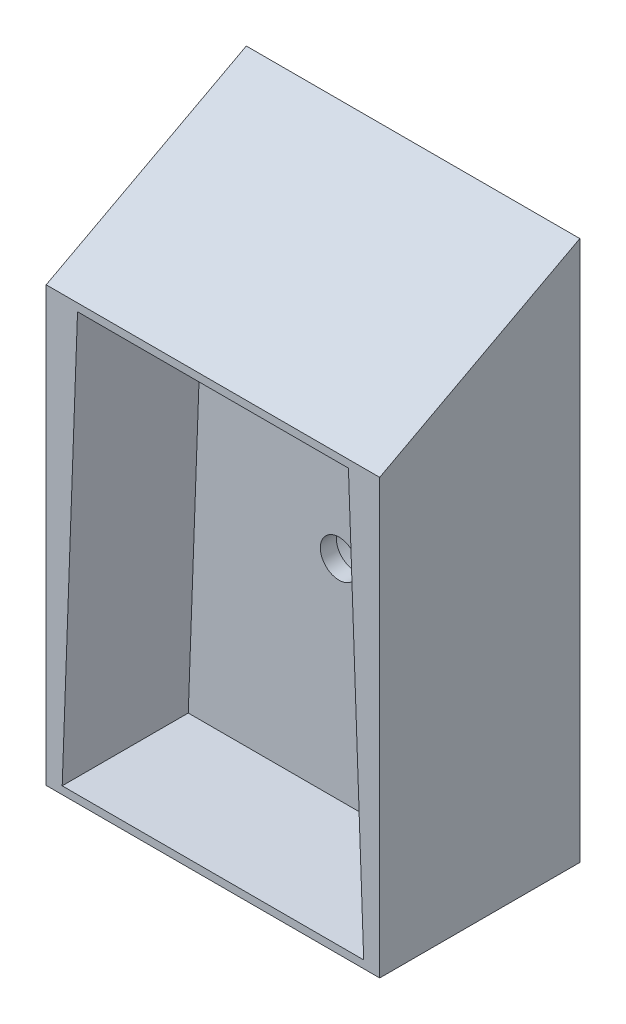
ISO-10303-21;
HEADER;
FILE_DESCRIPTION(('STEP AP214'),'2;1');
FILE_NAME('part.step','',(''),(''),'','','');
FILE_SCHEMA(('AUTOMOTIVE_DESIGN { 1 0 10303 214 1 1 1 1 }'));
ENDSEC;
DATA;
#1=APPLICATION_CONTEXT('core data for automotive mechanical design processes');
#2=APPLICATION_PROTOCOL_DEFINITION('international standard','automotive_design',2000,#1);
#3=PRODUCT_CONTEXT('',#1,'mechanical');
#4=PRODUCT('Part','Part','',(#3));
#5=PRODUCT_RELATED_PRODUCT_CATEGORY('part','',(#4));
#6=PRODUCT_DEFINITION_FORMATION('','',#4);
#7=PRODUCT_DEFINITION_CONTEXT('part definition',#1,'design');
#8=PRODUCT_DEFINITION('design','',#6,#7);
#9=PRODUCT_DEFINITION_SHAPE('','',#8);
#10=(LENGTH_UNIT() NAMED_UNIT(*) SI_UNIT(.MILLI.,.METRE.));
#11=(NAMED_UNIT(*) PLANE_ANGLE_UNIT() SI_UNIT($,.RADIAN.));
#12=(NAMED_UNIT(*) SI_UNIT($,.STERADIAN.) SOLID_ANGLE_UNIT());
#13=UNCERTAINTY_MEASURE_WITH_UNIT(LENGTH_MEASURE(1.E-05),#10,'distance_accuracy_value','');
#14=(GEOMETRIC_REPRESENTATION_CONTEXT(3) GLOBAL_UNCERTAINTY_ASSIGNED_CONTEXT((#13)) GLOBAL_UNIT_ASSIGNED_CONTEXT((#10,
#11,#12)) REPRESENTATION_CONTEXT('',''));
#15=CARTESIAN_POINT('',(0.,0.,0.));
#16=DIRECTION('',(0.,0.,1.));
#17=DIRECTION('',(1.,0.,0.));
#18=AXIS2_PLACEMENT_3D('',#15,#16,#17);
#19=CARTESIAN_POINT('',(0.,0.,0.));
#20=DIRECTION('',(0.,0.,1.));
#21=DIRECTION('',(1.,0.,0.));
#22=AXIS2_PLACEMENT_3D('',#19,#20,#21);
#23=CYLINDRICAL_SURFACE('',#22,2.8);
#24=CARTESIAN_POINT('',(0.,0.,11.1));
#25=DIRECTION('',(0.,0.,1.));
#26=DIRECTION('',(1.,0.,0.));
#27=AXIS2_PLACEMENT_3D('',#24,#25,#26);
#28=CIRCLE('',#27,2.8);
#29=CARTESIAN_POINT('',(2.8,0.,11.1));
#30=VERTEX_POINT('',#29);
#31=EDGE_CURVE('E380',#30,#30,#28,.T.);
#32=ORIENTED_EDGE('',*,*,#31,.T.);
#33=EDGE_LOOP('',(#32));
#34=FACE_BOUND('',#33,.T.);
#35=CARTESIAN_POINT('',(0.,0.,8.7));
#36=DIRECTION('',(0.,0.,-1.));
#37=DIRECTION('',(-1.,0.,0.));
#38=AXIS2_PLACEMENT_3D('',#35,#36,#37);
#39=CIRCLE('',#38,2.8);
#40=CARTESIAN_POINT('',(-2.8,0.,8.7));
#41=VERTEX_POINT('',#40);
#42=EDGE_CURVE('E44',#41,#41,#39,.F.);
#43=ORIENTED_EDGE('',*,*,#42,.F.);
#44=EDGE_LOOP('',(#43));
#45=FACE_BOUND('',#44,.T.);
#46=ADVANCED_FACE('F40',(#34,#45),#23,.F.);
#47=CARTESIAN_POINT('',(-25.,32.5,30.));
#48=DIRECTION('',(1.,0.,0.));
#49=DIRECTION('',(0.,1.,0.));
#50=AXIS2_PLACEMENT_3D('',#47,#48,#49);
#51=PLANE('',#50);
#52=DIRECTION('',(0.,-1.,0.));
#53=VECTOR('',#52,1.);
#54=CARTESIAN_POINT('',(-25.,32.5,0.));
#55=LINE('',#54,#53);
#56=CARTESIAN_POINT('',(-25.,48.5,0.));
#57=VERTEX_POINT('',#56);
#58=CARTESIAN_POINT('',(-25.,-32.5,0.));
#59=VERTEX_POINT('',#58);
#60=EDGE_CURVE('E155',#57,#59,#55,.T.);
#61=ORIENTED_EDGE('',*,*,#60,.T.);
#62=DIRECTION('',(0.,0.,-1.));
#63=VECTOR('',#62,1.);
#64=CARTESIAN_POINT('',(-25.,-32.5,30.));
#65=LINE('',#64,#63);
#66=CARTESIAN_POINT('',(-25.,-32.5,30.));
#67=VERTEX_POINT('',#66);
#68=EDGE_CURVE('E12',#67,#59,#65,.T.);
#69=ORIENTED_EDGE('',*,*,#68,.F.);
#70=DIRECTION('',(0.,-1.,0.));
#71=VECTOR('',#70,1.);
#72=CARTESIAN_POINT('',(-25.,32.5,30.));
#73=LINE('',#72,#71);
#74=CARTESIAN_POINT('',(-25.,32.5,30.));
#75=VERTEX_POINT('',#74);
#76=EDGE_CURVE('E156',#75,#67,#73,.T.);
#77=ORIENTED_EDGE('',*,*,#76,.F.);
#78=DIRECTION('',(0.,-0.470588235294118,0.882352941176471));
#79=VECTOR('',#78,1.);
#80=CARTESIAN_POINT('',(-25.,48.5,0.));
#81=LINE('',#80,#79);
#82=EDGE_CURVE('E147',#57,#75,#81,.T.);
#83=ORIENTED_EDGE('',*,*,#82,.F.);
#84=EDGE_LOOP('',(#61,#69,#77,#83));
#85=FACE_BOUND('',#84,.T.);
#86=ADVANCED_FACE('F42',(#85),#51,.F.);
#87=CARTESIAN_POINT('',(-25.,-32.5,30.));
#88=DIRECTION('',(0.,1.,0.));
#89=DIRECTION('',(0.,0.,1.));
#90=AXIS2_PLACEMENT_3D('',#87,#88,#89);
#91=PLANE('',#90);
#92=DIRECTION('',(1.,0.,0.));
#93=VECTOR('',#92,1.);
#94=CARTESIAN_POINT('',(-25.,-32.5,0.));
#95=LINE('',#94,#93);
#96=CARTESIAN_POINT('',(25.,-32.5,0.));
#97=VERTEX_POINT('',#96);
#98=EDGE_CURVE('E79',#59,#97,#95,.T.);
#99=ORIENTED_EDGE('',*,*,#98,.T.);
#100=DIRECTION('',(0.,0.,-1.));
#101=VECTOR('',#100,1.);
#102=CARTESIAN_POINT('',(25.,-32.5,30.));
#103=LINE('',#102,#101);
#104=CARTESIAN_POINT('',(25.,-32.5,30.));
#105=VERTEX_POINT('',#104);
#106=EDGE_CURVE('E49',#105,#97,#103,.T.);
#107=ORIENTED_EDGE('',*,*,#106,.F.);
#108=DIRECTION('',(1.,0.,0.));
#109=VECTOR('',#108,1.);
#110=CARTESIAN_POINT('',(-25.,-32.5,30.));
#111=LINE('',#110,#109);
#112=EDGE_CURVE('E84',#67,#105,#111,.T.);
#113=ORIENTED_EDGE('',*,*,#112,.F.);
#114=ORIENTED_EDGE('',*,*,#68,.T.);
#115=EDGE_LOOP('',(#99,#107,#113,#114));
#116=FACE_BOUND('',#115,.T.);
#117=ADVANCED_FACE('F190',(#116),#91,.F.);
#118=CARTESIAN_POINT('',(25.,32.5,30.));
#119=DIRECTION('',(-1.,0.,0.));
#120=DIRECTION('',(0.,0.,1.));
#121=AXIS2_PLACEMENT_3D('',#118,#119,#120);
#122=PLANE('',#121);
#123=DIRECTION('',(0.,1.,0.));
#124=VECTOR('',#123,1.);
#125=CARTESIAN_POINT('',(25.,32.5,0.));
#126=LINE('',#125,#124);
#127=CARTESIAN_POINT('',(25.,48.5,0.));
#128=VERTEX_POINT('',#127);
#129=EDGE_CURVE('E158',#97,#128,#126,.T.);
#130=ORIENTED_EDGE('',*,*,#129,.T.);
#131=DIRECTION('',(0.,-0.470588235294118,0.882352941176471));
#132=VECTOR('',#131,1.);
#133=CARTESIAN_POINT('',(25.,48.5,0.));
#134=LINE('',#133,#132);
#135=CARTESIAN_POINT('',(25.,32.5,30.));
#136=VERTEX_POINT('',#135);
#137=EDGE_CURVE('E145',#128,#136,#134,.T.);
#138=ORIENTED_EDGE('',*,*,#137,.T.);
#139=DIRECTION('',(0.,1.,0.));
#140=VECTOR('',#139,1.);
#141=CARTESIAN_POINT('',(25.,32.5,30.));
#142=LINE('',#141,#140);
#143=EDGE_CURVE('E160',#105,#136,#142,.T.);
#144=ORIENTED_EDGE('',*,*,#143,.F.);
#145=ORIENTED_EDGE('',*,*,#106,.T.);
#146=EDGE_LOOP('',(#130,#138,#144,#145));
#147=FACE_BOUND('',#146,.T.);
#148=ADVANCED_FACE('F170',(#147),#122,.F.);
#149=CARTESIAN_POINT('',(0.,0.,30.));
#150=DIRECTION('',(0.,0.,1.));
#151=DIRECTION('',(1.,0.,0.));
#152=AXIS2_PLACEMENT_3D('',#149,#150,#151);
#153=PLANE('',#152);
#154=DIRECTION('',(1.,0.,0.));
#155=VECTOR('',#154,1.);
#156=CARTESIAN_POINT('',(22.6,-31.35,30.));
#157=LINE('',#156,#155);
#158=CARTESIAN_POINT('',(-22.6,-31.35,30.));
#159=VERTEX_POINT('',#158);
#160=CARTESIAN_POINT('',(22.6,-31.35,30.));
#161=VERTEX_POINT('',#160);
#162=EDGE_CURVE('E56',#159,#161,#157,.T.);
#163=ORIENTED_EDGE('',*,*,#162,.F.);
#164=DIRECTION('',(-0.036657960183853,-0.99932787109895,0.));
#165=VECTOR('',#164,1.);
#166=CARTESIAN_POINT('',(-20.3,31.35,30.));
#167=LINE('',#166,#165);
#168=CARTESIAN_POINT('',(-20.3,31.35,30.));
#169=VERTEX_POINT('',#168);
#170=EDGE_CURVE('E134',#169,#159,#167,.T.);
#171=ORIENTED_EDGE('',*,*,#170,.F.);
#172=DIRECTION('',(-1.,0.,0.));
#173=VECTOR('',#172,1.);
#174=CARTESIAN_POINT('',(-20.3,31.35,30.));
#175=LINE('',#174,#173);
#176=CARTESIAN_POINT('',(20.31,31.35,30.));
#177=VERTEX_POINT('',#176);
#178=EDGE_CURVE('E118',#177,#169,#175,.T.);
#179=ORIENTED_EDGE('',*,*,#178,.F.);
#180=DIRECTION('',(-0.0364987905344166,0.999333697165029,0.));
#181=VECTOR('',#180,1.);
#182=CARTESIAN_POINT('',(20.31,31.35,30.));
#183=LINE('',#182,#181);
#184=EDGE_CURVE('E128',#161,#177,#183,.T.);
#185=ORIENTED_EDGE('',*,*,#184,.F.);
#186=EDGE_LOOP('',(#163,#171,#179,#185));
#187=FACE_BOUND('',#186,.T.);
#188=ORIENTED_EDGE('',*,*,#76,.T.);
#189=ORIENTED_EDGE('',*,*,#112,.T.);
#190=ORIENTED_EDGE('',*,*,#143,.T.);
#191=DIRECTION('',(-1.,0.,0.));
#192=VECTOR('',#191,1.);
#193=CARTESIAN_POINT('',(-25.,32.5,30.));
#194=LINE('',#193,#192);
#195=EDGE_CURVE('E65',#136,#75,#194,.T.);
#196=ORIENTED_EDGE('',*,*,#195,.T.);
#197=EDGE_LOOP('',(#188,#189,#190,#196));
#198=FACE_BOUND('',#197,.T.);
#199=ADVANCED_FACE('F132',(#187,#198),#153,.T.);
#200=CARTESIAN_POINT('',(0.,0.,0.));
#201=DIRECTION('',(0.,0.,1.));
#202=DIRECTION('',(1.,0.,0.));
#203=AXIS2_PLACEMENT_3D('',#200,#201,#202);
#204=PLANE('',#203);
#205=CARTESIAN_POINT('',(7.1490132204346,26.6072132920385,0.));
#206=DIRECTION('',(0.,0.,-1.));
#207=DIRECTION('',(1.,0.,0.));
#208=AXIS2_PLACEMENT_3D('',#205,#206,#207);
#209=CIRCLE('',#208,2.35);
#210=CARTESIAN_POINT('',(9.4990132204346,26.6072132920385,0.));
#211=VERTEX_POINT('',#210);
#212=EDGE_CURVE('E354',#211,#211,#209,.T.);
#213=ORIENTED_EDGE('',*,*,#212,.F.);
#214=EDGE_LOOP('',(#213));
#215=FACE_BOUND('',#214,.T.);
#216=CARTESIAN_POINT('',(-7.1490132204346,37.1927867079615,0.));
#217=DIRECTION('',(0.,0.,-1.));
#218=DIRECTION('',(1.,0.,0.));
#219=AXIS2_PLACEMENT_3D('',#216,#217,#218);
#220=CIRCLE('',#219,2.35);
#221=CARTESIAN_POINT('',(-4.7990132204346,37.1927867079615,0.));
#222=VERTEX_POINT('',#221);
#223=EDGE_CURVE('E368',#222,#222,#220,.T.);
#224=ORIENTED_EDGE('',*,*,#223,.F.);
#225=EDGE_LOOP('',(#224));
#226=FACE_BOUND('',#225,.T.);
#227=CARTESIAN_POINT('',(7.1490132204346,37.1927867079615,0.));
#228=DIRECTION('',(0.,0.,-1.));
#229=DIRECTION('',(-1.,0.,0.));
#230=AXIS2_PLACEMENT_3D('',#227,#228,#229);
#231=CIRCLE('',#230,2.35);
#232=CARTESIAN_POINT('',(4.7990132204346,37.1927867079615,0.));
#233=VERTEX_POINT('',#232);
#234=EDGE_CURVE('E363',#233,#233,#231,.T.);
#235=ORIENTED_EDGE('',*,*,#234,.F.);
#236=EDGE_LOOP('',(#235));
#237=FACE_BOUND('',#236,.T.);
#238=CARTESIAN_POINT('',(-7.1490132204346,26.6072132920385,0.));
#239=DIRECTION('',(0.,0.,-1.));
#240=DIRECTION('',(-1.,0.,0.));
#241=AXIS2_PLACEMENT_3D('',#238,#239,#240);
#242=CIRCLE('',#241,2.35);
#243=CARTESIAN_POINT('',(-9.4990132204346,26.6072132920385,0.));
#244=VERTEX_POINT('',#243);
#245=EDGE_CURVE('E353',#244,#244,#242,.T.);
#246=ORIENTED_EDGE('',*,*,#245,.F.);
#247=EDGE_LOOP('',(#246));
#248=FACE_BOUND('',#247,.T.);
#249=CARTESIAN_POINT('',(0.,0.,0.));
#250=DIRECTION('',(0.,0.,-1.));
#251=DIRECTION('',(-1.,0.,0.));
#252=AXIS2_PLACEMENT_3D('',#249,#250,#251);
#253=CIRCLE('',#252,7.5);
#254=CARTESIAN_POINT('',(-7.5,0.,0.));
#255=VERTEX_POINT('',#254);
#256=EDGE_CURVE('E373',#255,#255,#253,.T.);
#257=ORIENTED_EDGE('',*,*,#256,.F.);
#258=EDGE_LOOP('',(#257));
#259=FACE_BOUND('',#258,.T.);
#260=ORIENTED_EDGE('',*,*,#60,.F.);
#261=DIRECTION('',(1.,0.,0.));
#262=VECTOR('',#261,1.);
#263=CARTESIAN_POINT('',(-25.,48.5,0.));
#264=LINE('',#263,#262);
#265=EDGE_CURVE('E150',#57,#128,#264,.T.);
#266=ORIENTED_EDGE('',*,*,#265,.T.);
#267=ORIENTED_EDGE('',*,*,#129,.F.);
#268=ORIENTED_EDGE('',*,*,#98,.F.);
#269=EDGE_LOOP('',(#260,#266,#267,#268));
#270=FACE_BOUND('',#269,.T.);
#271=ADVANCED_FACE('F172',(#215,#226,#237,#248,#259,#270),#204,.F.);
#272=CARTESIAN_POINT('',(-25.,48.5,0.));
#273=DIRECTION('',(0.,0.882352941176471,0.470588235294118));
#274=DIRECTION('',(0.,-0.470588235294118,0.882352941176471));
#275=AXIS2_PLACEMENT_3D('',#272,#273,#274);
#276=PLANE('',#275);
#277=ORIENTED_EDGE('',*,*,#137,.F.);
#278=ORIENTED_EDGE('',*,*,#265,.F.);
#279=ORIENTED_EDGE('',*,*,#82,.T.);
#280=ORIENTED_EDGE('',*,*,#195,.F.);
#281=EDGE_LOOP('',(#277,#278,#279,#280));
#282=FACE_BOUND('',#281,.T.);
#283=ADVANCED_FACE('F177',(#282),#276,.T.);
#284=CARTESIAN_POINT('',(22.6,-31.35,-85.093790177478));
#285=DIRECTION('',(0.,-1.,0.));
#286=DIRECTION('',(0.,0.,-1.));
#287=AXIS2_PLACEMENT_3D('',#284,#285,#286);
#288=PLANE('',#287);
#289=DIRECTION('',(-1.,0.,0.));
#290=VECTOR('',#289,1.);
#291=CARTESIAN_POINT('',(22.6,-31.35,11.1));
#292=LINE('',#291,#290);
#293=CARTESIAN_POINT('',(22.6,-31.35,11.1));
#294=VERTEX_POINT('',#293);
#295=CARTESIAN_POINT('',(-22.6,-31.35,11.1));
#296=VERTEX_POINT('',#295);
#297=EDGE_CURVE('E146',#294,#296,#292,.T.);
#298=ORIENTED_EDGE('',*,*,#297,.T.);
#299=DIRECTION('',(0.,0.,1.));
#300=VECTOR('',#299,1.);
#301=CARTESIAN_POINT('',(-22.6,-31.35,-85.093790177478));
#302=LINE('',#301,#300);
#303=EDGE_CURVE('E139',#296,#159,#302,.T.);
#304=ORIENTED_EDGE('',*,*,#303,.T.);
#305=ORIENTED_EDGE('',*,*,#162,.T.);
#306=DIRECTION('',(0.,0.,1.));
#307=VECTOR('',#306,1.);
#308=CARTESIAN_POINT('',(22.6,-31.35,-85.093790177478));
#309=LINE('',#308,#307);
#310=EDGE_CURVE('E125',#294,#161,#309,.T.);
#311=ORIENTED_EDGE('',*,*,#310,.F.);
#312=EDGE_LOOP('',(#298,#304,#305,#311));
#313=FACE_BOUND('',#312,.T.);
#314=ADVANCED_FACE('F215',(#313),#288,.F.);
#315=CARTESIAN_POINT('',(-20.3,31.35,-85.093790177478));
#316=DIRECTION('',(-0.99932787109895,0.036657960183853,0.));
#317=DIRECTION('',(-0.036657960183853,-0.99932787109895,0.));
#318=AXIS2_PLACEMENT_3D('',#315,#316,#317);
#319=PLANE('',#318);
#320=DIRECTION('',(0.036657960183853,0.99932787109895,0.));
#321=VECTOR('',#320,1.);
#322=CARTESIAN_POINT('',(-20.3,31.35,11.1));
#323=LINE('',#322,#321);
#324=CARTESIAN_POINT('',(-20.3,31.35,11.1));
#325=VERTEX_POINT('',#324);
#326=EDGE_CURVE('E383',#296,#325,#323,.T.);
#327=ORIENTED_EDGE('',*,*,#326,.T.);
#328=DIRECTION('',(0.,0.,1.));
#329=VECTOR('',#328,1.);
#330=CARTESIAN_POINT('',(-20.3,31.35,-85.093790177478));
#331=LINE('',#330,#329);
#332=EDGE_CURVE('E124',#325,#169,#331,.T.);
#333=ORIENTED_EDGE('',*,*,#332,.T.);
#334=ORIENTED_EDGE('',*,*,#170,.T.);
#335=ORIENTED_EDGE('',*,*,#303,.F.);
#336=EDGE_LOOP('',(#327,#333,#334,#335));
#337=FACE_BOUND('',#336,.T.);
#338=ADVANCED_FACE('F212',(#337),#319,.F.);
#339=CARTESIAN_POINT('',(-20.3,31.35,-85.093790177478));
#340=DIRECTION('',(0.,1.,0.));
#341=DIRECTION('',(-1.,0.,0.));
#342=AXIS2_PLACEMENT_3D('',#339,#340,#341);
#343=PLANE('',#342);
#344=DIRECTION('',(1.,0.,0.));
#345=VECTOR('',#344,1.);
#346=CARTESIAN_POINT('',(-20.3,31.35,11.1));
#347=LINE('',#346,#345);
#348=CARTESIAN_POINT('',(20.31,31.35,11.1));
#349=VERTEX_POINT('',#348);
#350=EDGE_CURVE('E121',#325,#349,#347,.T.);
#351=ORIENTED_EDGE('',*,*,#350,.T.);
#352=DIRECTION('',(0.,0.,1.));
#353=VECTOR('',#352,1.);
#354=CARTESIAN_POINT('',(20.31,31.35,-85.093790177478));
#355=LINE('',#354,#353);
#356=EDGE_CURVE('E113',#349,#177,#355,.T.);
#357=ORIENTED_EDGE('',*,*,#356,.T.);
#358=ORIENTED_EDGE('',*,*,#178,.T.);
#359=ORIENTED_EDGE('',*,*,#332,.F.);
#360=EDGE_LOOP('',(#351,#357,#358,#359));
#361=FACE_BOUND('',#360,.T.);
#362=ADVANCED_FACE('F115',(#361),#343,.F.);
#363=CARTESIAN_POINT('',(20.31,31.35,-85.093790177478));
#364=DIRECTION('',(0.999333697165028,0.0364987905344166,0.));
#365=DIRECTION('',(-0.0364987905344166,0.999333697165029,0.));
#366=AXIS2_PLACEMENT_3D('',#363,#364,#365);
#367=PLANE('',#366);
#368=DIRECTION('',(0.0364987905344166,-0.999333697165029,0.));
#369=VECTOR('',#368,1.);
#370=CARTESIAN_POINT('',(20.31,31.35,11.1));
#371=LINE('',#370,#369);
#372=EDGE_CURVE('E143',#349,#294,#371,.T.);
#373=ORIENTED_EDGE('',*,*,#372,.T.);
#374=ORIENTED_EDGE('',*,*,#310,.T.);
#375=ORIENTED_EDGE('',*,*,#184,.T.);
#376=ORIENTED_EDGE('',*,*,#356,.F.);
#377=EDGE_LOOP('',(#373,#374,#375,#376));
#378=FACE_BOUND('',#377,.T.);
#379=ADVANCED_FACE('F129',(#378),#367,.F.);
#380=CARTESIAN_POINT('',(0.,0.,11.1));
#381=DIRECTION('',(0.,0.,1.));
#382=DIRECTION('',(1.,0.,0.));
#383=AXIS2_PLACEMENT_3D('',#380,#381,#382);
#384=PLANE('',#383);
#385=ORIENTED_EDGE('',*,*,#31,.F.);
#386=EDGE_LOOP('',(#385));
#387=FACE_BOUND('',#386,.T.);
#388=ORIENTED_EDGE('',*,*,#297,.F.);
#389=ORIENTED_EDGE('',*,*,#372,.F.);
#390=ORIENTED_EDGE('',*,*,#350,.F.);
#391=ORIENTED_EDGE('',*,*,#326,.F.);
#392=EDGE_LOOP('',(#388,#389,#390,#391));
#393=FACE_BOUND('',#392,.T.);
#394=ADVANCED_FACE('F207',(#387,#393),#384,.T.);
#395=CARTESIAN_POINT('',(0.,0.,8.7));
#396=DIRECTION('',(0.,0.,-1.));
#397=DIRECTION('',(-1.,0.,0.));
#398=AXIS2_PLACEMENT_3D('',#395,#396,#397);
#399=PLANE('',#398);
#400=CARTESIAN_POINT('',(0.,0.,8.7));
#401=DIRECTION('',(0.,0.,-1.));
#402=DIRECTION('',(-1.,0.,0.));
#403=AXIS2_PLACEMENT_3D('',#400,#401,#402);
#404=CIRCLE('',#403,7.5);
#405=CARTESIAN_POINT('',(-7.5,0.,8.7));
#406=VERTEX_POINT('',#405);
#407=EDGE_CURVE('E375',#406,#406,#404,.T.);
#408=ORIENTED_EDGE('',*,*,#407,.T.);
#409=EDGE_LOOP('',(#408));
#410=FACE_BOUND('',#409,.T.);
#411=ORIENTED_EDGE('',*,*,#42,.T.);
#412=EDGE_LOOP('',(#411));
#413=FACE_BOUND('',#412,.T.);
#414=ADVANCED_FACE('F210',(#410,#413),#399,.T.);
#415=CARTESIAN_POINT('',(0.,0.,8.7));
#416=DIRECTION('',(0.,0.,-1.));
#417=DIRECTION('',(-1.,0.,0.));
#418=AXIS2_PLACEMENT_3D('',#415,#416,#417);
#419=CYLINDRICAL_SURFACE('',#418,7.5);
#420=ORIENTED_EDGE('',*,*,#407,.F.);
#421=EDGE_LOOP('',(#420));
#422=FACE_BOUND('',#421,.T.);
#423=ORIENTED_EDGE('',*,*,#256,.T.);
#424=EDGE_LOOP('',(#423));
#425=FACE_BOUND('',#424,.T.);
#426=ADVANCED_FACE('F205',(#422,#425),#419,.F.);
#427=CARTESIAN_POINT('',(-7.1490132204346,26.6072132920385,8.5));
#428=DIRECTION('',(0.,0.,-1.));
#429=DIRECTION('',(-1.,0.,0.));
#430=AXIS2_PLACEMENT_3D('',#427,#428,#429);
#431=CYLINDRICAL_SURFACE('',#430,2.35);
#432=CARTESIAN_POINT('',(-7.1490132204346,26.6072132920385,8.5));
#433=DIRECTION('',(0.,0.,-1.));
#434=DIRECTION('',(-1.,0.,0.));
#435=AXIS2_PLACEMENT_3D('',#432,#433,#434);
#436=CIRCLE('',#435,2.35);
#437=CARTESIAN_POINT('',(-9.4990132204346,26.6072132920385,8.5));
#438=VERTEX_POINT('',#437);
#439=EDGE_CURVE('E357',#438,#438,#436,.T.);
#440=ORIENTED_EDGE('',*,*,#439,.F.);
#441=EDGE_LOOP('',(#440));
#442=FACE_BOUND('',#441,.T.);
#443=ORIENTED_EDGE('',*,*,#245,.T.);
#444=EDGE_LOOP('',(#443));
#445=FACE_BOUND('',#444,.T.);
#446=ADVANCED_FACE('F265',(#442,#445),#431,.F.);
#447=CARTESIAN_POINT('',(-7.1490132204346,26.6072132920385,8.5));
#448=DIRECTION('',(0.,0.,-1.));
#449=DIRECTION('',(-1.,0.,0.));
#450=AXIS2_PLACEMENT_3D('',#447,#448,#449);
#451=PLANE('',#450);
#452=ORIENTED_EDGE('',*,*,#439,.T.);
#453=EDGE_LOOP('',(#452));
#454=FACE_BOUND('',#453,.T.);
#455=ADVANCED_FACE('F276',(#454),#451,.T.);
#456=CARTESIAN_POINT('',(7.1490132204346,37.1927867079615,8.5));
#457=DIRECTION('',(0.,0.,-1.));
#458=DIRECTION('',(-1.,0.,0.));
#459=AXIS2_PLACEMENT_3D('',#456,#457,#458);
#460=CYLINDRICAL_SURFACE('',#459,2.35);
#461=CARTESIAN_POINT('',(7.1490132204346,37.1927867079615,8.5));
#462=DIRECTION('',(0.,0.,-1.));
#463=DIRECTION('',(-1.,0.,0.));
#464=AXIS2_PLACEMENT_3D('',#461,#462,#463);
#465=CIRCLE('',#464,2.35);
#466=CARTESIAN_POINT('',(4.7990132204346,37.1927867079615,8.5));
#467=VERTEX_POINT('',#466);
#468=EDGE_CURVE('E371',#467,#467,#465,.T.);
#469=ORIENTED_EDGE('',*,*,#468,.F.);
#470=EDGE_LOOP('',(#469));
#471=FACE_BOUND('',#470,.T.);
#472=ORIENTED_EDGE('',*,*,#234,.T.);
#473=EDGE_LOOP('',(#472));
#474=FACE_BOUND('',#473,.T.);
#475=ADVANCED_FACE('F286',(#471,#474),#460,.F.);
#476=CARTESIAN_POINT('',(7.1490132204346,37.1927867079615,8.5));
#477=DIRECTION('',(0.,0.,-1.));
#478=DIRECTION('',(-1.,0.,0.));
#479=AXIS2_PLACEMENT_3D('',#476,#477,#478);
#480=PLANE('',#479);
#481=ORIENTED_EDGE('',*,*,#468,.T.);
#482=EDGE_LOOP('',(#481));
#483=FACE_BOUND('',#482,.T.);
#484=ADVANCED_FACE('F296',(#483),#480,.T.);
#485=CARTESIAN_POINT('',(-7.1490132204346,37.1927867079615,8.5));
#486=DIRECTION('',(0.,0.,-1.));
#487=DIRECTION('',(-1.,0.,0.));
#488=AXIS2_PLACEMENT_3D('',#485,#486,#487);
#489=CYLINDRICAL_SURFACE('',#488,2.35);
#490=CARTESIAN_POINT('',(-7.1490132204346,37.1927867079615,8.5));
#491=DIRECTION('',(0.,0.,-1.));
#492=DIRECTION('',(1.,0.,0.));
#493=AXIS2_PLACEMENT_3D('',#490,#491,#492);
#494=CIRCLE('',#493,2.35);
#495=CARTESIAN_POINT('',(-4.7990132204346,37.1927867079615,8.5));
#496=VERTEX_POINT('',#495);
#497=EDGE_CURVE('E360',#496,#496,#494,.T.);
#498=ORIENTED_EDGE('',*,*,#497,.F.);
#499=EDGE_LOOP('',(#498));
#500=FACE_BOUND('',#499,.T.);
#501=ORIENTED_EDGE('',*,*,#223,.T.);
#502=EDGE_LOOP('',(#501));
#503=FACE_BOUND('',#502,.T.);
#504=ADVANCED_FACE('F306',(#500,#503),#489,.F.);
#505=CARTESIAN_POINT('',(-7.1490132204346,37.1927867079615,8.5));
#506=DIRECTION('',(0.,0.,1.));
#507=DIRECTION('',(1.,0.,0.));
#508=AXIS2_PLACEMENT_3D('',#505,#506,#507);
#509=PLANE('',#508);
#510=ORIENTED_EDGE('',*,*,#497,.T.);
#511=EDGE_LOOP('',(#510));
#512=FACE_BOUND('',#511,.T.);
#513=ADVANCED_FACE('F316',(#512),#509,.F.);
#514=CARTESIAN_POINT('',(7.1490132204346,26.6072132920385,8.5));
#515=DIRECTION('',(0.,0.,-1.));
#516=DIRECTION('',(-1.,0.,0.));
#517=AXIS2_PLACEMENT_3D('',#514,#515,#516);
#518=CYLINDRICAL_SURFACE('',#517,2.35);
#519=CARTESIAN_POINT('',(7.1490132204346,26.6072132920385,8.5));
#520=DIRECTION('',(0.,0.,-1.));
#521=DIRECTION('',(1.,0.,0.));
#522=AXIS2_PLACEMENT_3D('',#519,#520,#521);
#523=CIRCLE('',#522,2.35);
#524=CARTESIAN_POINT('',(9.4990132204346,26.6072132920385,8.5));
#525=VERTEX_POINT('',#524);
#526=EDGE_CURVE('E352',#525,#525,#523,.T.);
#527=ORIENTED_EDGE('',*,*,#526,.F.);
#528=EDGE_LOOP('',(#527));
#529=FACE_BOUND('',#528,.T.);
#530=ORIENTED_EDGE('',*,*,#212,.T.);
#531=EDGE_LOOP('',(#530));
#532=FACE_BOUND('',#531,.T.);
#533=ADVANCED_FACE('F326',(#529,#532),#518,.F.);
#534=CARTESIAN_POINT('',(7.1490132204346,26.6072132920385,8.5));
#535=DIRECTION('',(0.,0.,1.));
#536=DIRECTION('',(1.,0.,0.));
#537=AXIS2_PLACEMENT_3D('',#534,#535,#536);
#538=PLANE('',#537);
#539=ORIENTED_EDGE('',*,*,#526,.T.);
#540=EDGE_LOOP('',(#539));
#541=FACE_BOUND('',#540,.T.);
#542=ADVANCED_FACE('F336',(#541),#538,.F.);
#543=CLOSED_SHELL('',(#46,#86,#117,#148,#199,#271,#283,#314,#338,#362,#379,#394,#414,#426,#446,
#455,#475,#484,#504,#513,#533,#542));
#544=MANIFOLD_SOLID_BREP('B2',#543);
#545=ADVANCED_BREP_SHAPE_REPRESENTATION('',(#18,#544),#14);
#546=SHAPE_DEFINITION_REPRESENTATION(#9,#545);
ENDSEC;
END-ISO-10303-21;
